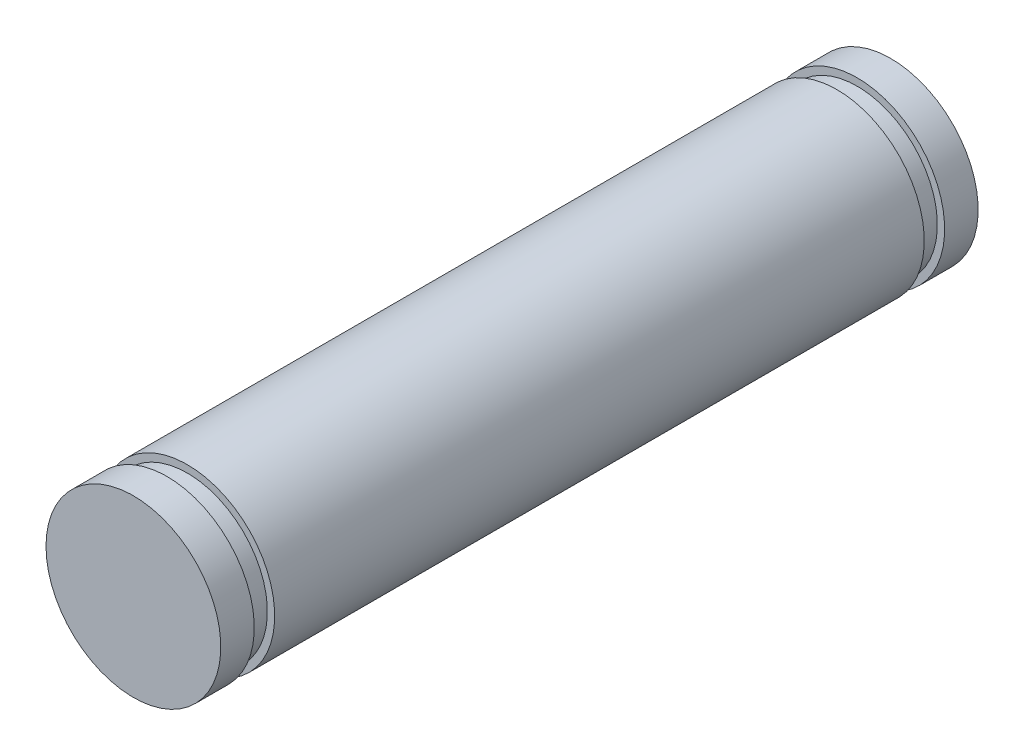
ISO-10303-21;
HEADER;
FILE_DESCRIPTION(('STEP AP214'),'2;1');
FILE_NAME('part.step','',(''),(''),'','','');
FILE_SCHEMA(('AUTOMOTIVE_DESIGN { 1 0 10303 214 1 1 1 1 }'));
ENDSEC;
DATA;
#1=APPLICATION_CONTEXT('core data for automotive mechanical design processes');
#2=APPLICATION_PROTOCOL_DEFINITION('international standard','automotive_design',2000,#1);
#3=PRODUCT_CONTEXT('',#1,'mechanical');
#4=PRODUCT('Part','Part','',(#3));
#5=PRODUCT_RELATED_PRODUCT_CATEGORY('part','',(#4));
#6=PRODUCT_DEFINITION_FORMATION('','',#4);
#7=PRODUCT_DEFINITION_CONTEXT('part definition',#1,'design');
#8=PRODUCT_DEFINITION('design','',#6,#7);
#9=PRODUCT_DEFINITION_SHAPE('','',#8);
#10=(LENGTH_UNIT() NAMED_UNIT(*) SI_UNIT(.MILLI.,.METRE.));
#11=(NAMED_UNIT(*) PLANE_ANGLE_UNIT() SI_UNIT($,.RADIAN.));
#12=(NAMED_UNIT(*) SI_UNIT($,.STERADIAN.) SOLID_ANGLE_UNIT());
#13=UNCERTAINTY_MEASURE_WITH_UNIT(LENGTH_MEASURE(1.E-05),#10,'distance_accuracy_value','');
#14=(GEOMETRIC_REPRESENTATION_CONTEXT(3) GLOBAL_UNCERTAINTY_ASSIGNED_CONTEXT((#13)) GLOBAL_UNIT_ASSIGNED_CONTEXT((#10,
#11,#12)) REPRESENTATION_CONTEXT('',''));
#15=CARTESIAN_POINT('',(0.,0.,0.));
#16=DIRECTION('',(0.,0.,1.));
#17=DIRECTION('',(1.,0.,0.));
#18=AXIS2_PLACEMENT_3D('',#15,#16,#17);
#19=CARTESIAN_POINT('',(0.,0.,26.));
#20=DIRECTION('',(0.,0.,-1.));
#21=DIRECTION('',(-1.,0.,0.));
#22=AXIS2_PLACEMENT_3D('',#19,#20,#21);
#23=CYLINDRICAL_SURFACE('',#22,3.);
#24=CARTESIAN_POINT('',(0.,0.,1.85));
#25=DIRECTION('',(0.,0.,-1.));
#26=DIRECTION('',(-1.,0.,0.));
#27=AXIS2_PLACEMENT_3D('',#24,#25,#26);
#28=CIRCLE('',#27,3.);
#29=CARTESIAN_POINT('',(-3.,0.,1.85));
#30=VERTEX_POINT('',#29);
#31=EDGE_CURVE('E82',#30,#30,#28,.T.);
#32=CARTESIAN_POINT('',(0.,0.,24.15));
#33=DIRECTION('',(0.,0.,-1.));
#34=DIRECTION('',(-1.,0.,0.));
#35=AXIS2_PLACEMENT_3D('',#32,#33,#34);
#36=CIRCLE('',#35,3.);
#37=CARTESIAN_POINT('',(-3.,0.,24.15));
#38=VERTEX_POINT('',#37);
#39=EDGE_CURVE('E98',#38,#38,#36,.T.);
#40=CARTESIAN_POINT('',(-3.,0.,1.85));
#41=CARTESIAN_POINT('',(-3.,0.,2.08229166666666));
#42=CARTESIAN_POINT('',(-3.,0.,2.31458333333333));
#43=CARTESIAN_POINT('',(-3.,0.,2.77916666666666));
#44=CARTESIAN_POINT('',(-3.,0.,3.01145833333333));
#45=CARTESIAN_POINT('',(-3.,0.,3.47604166666666));
#46=CARTESIAN_POINT('',(-3.,0.,3.70833333333333));
#47=CARTESIAN_POINT('',(-3.,0.,4.17291666666666));
#48=CARTESIAN_POINT('',(-3.,0.,4.40520833333333));
#49=CARTESIAN_POINT('',(-3.,0.,4.86979166666667));
#50=CARTESIAN_POINT('',(-3.,0.,5.10208333333333));
#51=CARTESIAN_POINT('',(-3.,0.,5.56666666666666));
#52=CARTESIAN_POINT('',(-3.,0.,5.79895833333333));
#53=CARTESIAN_POINT('',(-3.,0.,6.26354166666667));
#54=CARTESIAN_POINT('',(-3.,0.,6.49583333333333));
#55=CARTESIAN_POINT('',(-3.,0.,6.96041666666667));
#56=CARTESIAN_POINT('',(-3.,0.,7.19270833333333));
#57=CARTESIAN_POINT('',(-3.,0.,7.65729166666667));
#58=CARTESIAN_POINT('',(-3.,0.,7.88958333333333));
#59=CARTESIAN_POINT('',(-3.,0.,8.35416666666667));
#60=CARTESIAN_POINT('',(-3.,0.,8.58645833333333));
#61=CARTESIAN_POINT('',(-3.,0.,9.05104166666667));
#62=CARTESIAN_POINT('',(-3.,0.,9.28333333333333));
#63=CARTESIAN_POINT('',(-3.,0.,9.74791666666667));
#64=CARTESIAN_POINT('',(-3.,0.,9.98020833333333));
#65=CARTESIAN_POINT('',(-3.,0.,10.4447916666667));
#66=CARTESIAN_POINT('',(-3.,0.,10.6770833333333));
#67=CARTESIAN_POINT('',(-3.,0.,11.1416666666667));
#68=CARTESIAN_POINT('',(-3.,0.,11.3739583333333));
#69=CARTESIAN_POINT('',(-3.,0.,11.8385416666667));
#70=CARTESIAN_POINT('',(-3.,0.,12.0708333333333));
#71=CARTESIAN_POINT('',(-3.,0.,12.5354166666667));
#72=CARTESIAN_POINT('',(-3.,0.,12.7677083333333));
#73=CARTESIAN_POINT('',(-3.,0.,13.2322916666667));
#74=CARTESIAN_POINT('',(-3.,0.,13.4645833333333));
#75=CARTESIAN_POINT('',(-3.,0.,13.9291666666667));
#76=CARTESIAN_POINT('',(-3.,0.,14.1614583333333));
#77=CARTESIAN_POINT('',(-3.,0.,14.6260416666667));
#78=CARTESIAN_POINT('',(-3.,0.,14.8583333333333));
#79=CARTESIAN_POINT('',(-3.,0.,15.3229166666667));
#80=CARTESIAN_POINT('',(-3.,0.,15.5552083333333));
#81=CARTESIAN_POINT('',(-3.,0.,16.0197916666667));
#82=CARTESIAN_POINT('',(-3.,0.,16.2520833333333));
#83=CARTESIAN_POINT('',(-3.,0.,16.7166666666667));
#84=CARTESIAN_POINT('',(-3.,0.,16.9489583333333));
#85=CARTESIAN_POINT('',(-3.,0.,17.4135416666667));
#86=CARTESIAN_POINT('',(-3.,0.,17.6458333333333));
#87=CARTESIAN_POINT('',(-3.,0.,18.1104166666667));
#88=CARTESIAN_POINT('',(-3.,0.,18.3427083333333));
#89=CARTESIAN_POINT('',(-3.,0.,18.8072916666667));
#90=CARTESIAN_POINT('',(-3.,0.,19.0395833333333));
#91=CARTESIAN_POINT('',(-3.,0.,19.5041666666667));
#92=CARTESIAN_POINT('',(-3.,0.,19.7364583333333));
#93=CARTESIAN_POINT('',(-3.,0.,20.2010416666667));
#94=CARTESIAN_POINT('',(-3.,0.,20.4333333333333));
#95=CARTESIAN_POINT('',(-3.,0.,20.8979166666667));
#96=CARTESIAN_POINT('',(-3.,0.,21.1302083333333));
#97=CARTESIAN_POINT('',(-3.,0.,21.5947916666667));
#98=CARTESIAN_POINT('',(-3.,0.,21.8270833333333));
#99=CARTESIAN_POINT('',(-3.,0.,22.2916666666667));
#100=CARTESIAN_POINT('',(-3.,0.,22.5239583333333));
#101=CARTESIAN_POINT('',(-3.,0.,22.9885416666667));
#102=CARTESIAN_POINT('',(-3.,0.,23.2208333333333));
#103=CARTESIAN_POINT('',(-3.,0.,23.6854166666667));
#104=CARTESIAN_POINT('',(-3.,0.,23.9177083333333));
#105=CARTESIAN_POINT('',(-3.,0.,24.15));
#106=B_SPLINE_CURVE_WITH_KNOTS('',3,(#40,#41,#42,#43,#44,#45,#46,#47,#48,#49,#50,#51,#52,#53,
#54,#55,#56,#57,#58,#59,#60,#61,#62,#63,#64,#65,#66,#67,#68,#69,#70,#71,#72,#73,#74,#75,#76,#77,
#78,#79,#80,#81,#82,#83,#84,#85,#86,#87,#88,#89,#90,#91,#92,#93,#94,#95,#96,#97,#98,#99,#100,
#101,#102,#103,#104,#105),.UNSPECIFIED.,.F.,.F.,(4,2,2,2,2,2,2,2,2,2,2,2,2,2,2,2,2,2,2,2,2,2,2,
2,2,2,2,2,2,2,2,2,4),(0.,0.696875,1.39375,2.090625,2.7875,3.484375,4.18125,4.878125,5.575,
6.271875,6.96875,7.665625,8.3625,9.059375,9.75625,10.453125,11.15,11.846875,12.54375,13.240625,
13.9375,14.634375,15.33125,16.028125,16.725,17.421875,18.11875,18.815625,19.5125,20.209375,
20.90625,21.603125,22.3),.UNSPECIFIED.);
#107=EDGE_CURVE('BSEAM60',#30,#38,#106,.T.);
#108=ORIENTED_EDGE('',*,*,#31,.F.);
#109=ORIENTED_EDGE('',*,*,#39,.T.);
#110=ORIENTED_EDGE('',*,*,#107,.T.);
#111=ORIENTED_EDGE('',*,*,#107,.F.);
#112=EDGE_LOOP('',(#108,#110,#109,#111));
#113=FACE_BOUND('',#112,.T.);
#114=ADVANCED_FACE('F60',(#113),#23,.T.);
#115=CARTESIAN_POINT('',(0.,0.,1.15));
#116=DIRECTION('',(0.,0.,-1.));
#117=DIRECTION('',(-1.,0.,0.));
#118=AXIS2_PLACEMENT_3D('',#115,#116,#117);
#119=CIRCLE('',#118,3.);
#120=CARTESIAN_POINT('',(-3.,0.,1.15));
#121=VERTEX_POINT('',#120);
#122=EDGE_CURVE('E73',#121,#121,#119,.T.);
#123=CARTESIAN_POINT('',(0.,0.,0.));
#124=DIRECTION('',(0.,0.,1.));
#125=DIRECTION('',(1.,0.,0.));
#126=AXIS2_PLACEMENT_3D('',#123,#124,#125);
#127=CIRCLE('',#126,3.);
#128=CARTESIAN_POINT('',(-3.,0.,0.));
#129=VERTEX_POINT('',#128);
#130=EDGE_CURVE('E64',#129,#129,#127,.T.);
#131=CARTESIAN_POINT('',(-3.,0.,1.15));
#132=CARTESIAN_POINT('',(-3.,0.,1.13802083333333));
#133=CARTESIAN_POINT('',(-3.,0.,1.12604166666667));
#134=CARTESIAN_POINT('',(-3.,0.,1.10208333333333));
#135=CARTESIAN_POINT('',(-3.,0.,1.09010416666667));
#136=CARTESIAN_POINT('',(-3.,0.,1.06614583333333));
#137=CARTESIAN_POINT('',(-3.,0.,1.05416666666667));
#138=CARTESIAN_POINT('',(-3.,0.,1.03020833333333));
#139=CARTESIAN_POINT('',(-3.,0.,1.01822916666667));
#140=CARTESIAN_POINT('',(-3.,0.,0.994270833333332));
#141=CARTESIAN_POINT('',(-3.,0.,0.982291666666665));
#142=CARTESIAN_POINT('',(-3.,0.,0.958333333333331));
#143=CARTESIAN_POINT('',(-3.,0.,0.946354166666664));
#144=CARTESIAN_POINT('',(-3.,0.,0.922395833333331));
#145=CARTESIAN_POINT('',(-3.,0.,0.910416666666665));
#146=CARTESIAN_POINT('',(-3.,0.,0.886458333333332));
#147=CARTESIAN_POINT('',(-3.,0.,0.874479166666665));
#148=CARTESIAN_POINT('',(-3.,0.,0.850520833333332));
#149=CARTESIAN_POINT('',(-3.,0.,0.838541666666666));
#150=CARTESIAN_POINT('',(-3.,0.,0.814583333333333));
#151=CARTESIAN_POINT('',(-3.,0.,0.802604166666666));
#152=CARTESIAN_POINT('',(-3.,0.,0.778645833333333));
#153=CARTESIAN_POINT('',(-3.,0.,0.766666666666667));
#154=CARTESIAN_POINT('',(-3.,0.,0.742708333333333));
#155=CARTESIAN_POINT('',(-3.,0.,0.730729166666665));
#156=CARTESIAN_POINT('',(-3.,0.,0.706770833333331));
#157=CARTESIAN_POINT('',(-3.,0.,0.694791666666664));
#158=CARTESIAN_POINT('',(-3.,0.,0.670833333333331));
#159=CARTESIAN_POINT('',(-3.,0.,0.658854166666665));
#160=CARTESIAN_POINT('',(-3.,0.,0.634895833333332));
#161=CARTESIAN_POINT('',(-3.,0.,0.622916666666665));
#162=CARTESIAN_POINT('',(-3.,0.,0.598958333333332));
#163=CARTESIAN_POINT('',(-3.,0.,0.586979166666666));
#164=CARTESIAN_POINT('',(-3.,0.,0.563020833333333));
#165=CARTESIAN_POINT('',(-3.,0.,0.551041666666666));
#166=CARTESIAN_POINT('',(-3.,0.,0.527083333333333));
#167=CARTESIAN_POINT('',(-3.,0.,0.515104166666667));
#168=CARTESIAN_POINT('',(-3.,0.,0.491145833333334));
#169=CARTESIAN_POINT('',(-3.,0.,0.479166666666667));
#170=CARTESIAN_POINT('',(-3.,0.,0.455208333333334));
#171=CARTESIAN_POINT('',(-3.,0.,0.443229166666668));
#172=CARTESIAN_POINT('',(-3.,0.,0.419270833333333));
#173=CARTESIAN_POINT('',(-3.,0.,0.407291666666666));
#174=CARTESIAN_POINT('',(-3.,0.,0.383333333333332));
#175=CARTESIAN_POINT('',(-3.,0.,0.371354166666665));
#176=CARTESIAN_POINT('',(-3.,0.,0.347395833333332));
#177=CARTESIAN_POINT('',(-3.,0.,0.335416666666666));
#178=CARTESIAN_POINT('',(-3.,0.,0.311458333333333));
#179=CARTESIAN_POINT('',(-3.,0.,0.299479166666666));
#180=CARTESIAN_POINT('',(-3.,0.,0.275520833333333));
#181=CARTESIAN_POINT('',(-3.,0.,0.263541666666667));
#182=CARTESIAN_POINT('',(-3.,0.,0.239583333333334));
#183=CARTESIAN_POINT('',(-3.,0.,0.227604166666667));
#184=CARTESIAN_POINT('',(-3.,0.,0.203645833333334));
#185=CARTESIAN_POINT('',(-3.,0.,0.191666666666668));
#186=CARTESIAN_POINT('',(-3.,0.,0.167708333333333));
#187=CARTESIAN_POINT('',(-3.,0.,0.155729166666666));
#188=CARTESIAN_POINT('',(-3.,0.,0.131770833333332));
#189=CARTESIAN_POINT('',(-3.,0.,0.119791666666665));
#190=CARTESIAN_POINT('',(-3.,0.,0.095833333333332));
#191=CARTESIAN_POINT('',(-3.,0.,0.0838541666666655));
#192=CARTESIAN_POINT('',(-3.,0.,0.0598958333333325));
#193=CARTESIAN_POINT('',(-3.,0.,0.047916666666666));
#194=CARTESIAN_POINT('',(-3.,0.,0.023958333333333));
#195=CARTESIAN_POINT('',(-3.,0.,0.0119791666666665));
#196=CARTESIAN_POINT('',(-3.,0.,0.));
#197=B_SPLINE_CURVE_WITH_KNOTS('',3,(#131,#132,#133,#134,#135,#136,#137,#138,#139,#140,#141,
#142,#143,#144,#145,#146,#147,#148,#149,#150,#151,#152,#153,#154,#155,#156,#157,#158,#159,#160,
#161,#162,#163,#164,#165,#166,#167,#168,#169,#170,#171,#172,#173,#174,#175,#176,#177,#178,#179,
#180,#181,#182,#183,#184,#185,#186,#187,#188,#189,#190,#191,#192,#193,#194,#195,#196),
.UNSPECIFIED.,.F.,.F.,(4,2,2,2,2,2,2,2,2,2,2,2,2,2,2,2,2,2,2,2,2,2,2,2,2,2,2,2,2,2,2,2,4),(0.,
0.0359374999999995,0.071874999999999,0.107812499999999,0.143749999999998,0.179687500000001,
0.215625000000001,0.2515625,0.2875,0.323437499999999,0.359374999999999,0.395312499999998,
0.431250000000001,0.467187500000001,0.503125,0.5390625,0.574999999999999,0.610937499999999,
0.646874999999998,0.682812499999998,0.718749999999997,0.7546875,0.790625,0.826562499999999,
0.862499999999999,0.898437499999998,0.934374999999998,0.970312499999997,1.00625,1.0421875,
1.078125,1.1140625,1.15),.UNSPECIFIED.);
#198=EDGE_CURVE('BSEAM62',#121,#129,#197,.T.);
#199=ORIENTED_EDGE('',*,*,#122,.T.);
#200=ORIENTED_EDGE('',*,*,#130,.T.);
#201=ORIENTED_EDGE('',*,*,#198,.T.);
#202=ORIENTED_EDGE('',*,*,#198,.F.);
#203=EDGE_LOOP('',(#199,#201,#200,#202));
#204=FACE_BOUND('',#203,.T.);
#205=ADVANCED_FACE('F62',(#204),#23,.T.);
#206=CARTESIAN_POINT('',(0.,0.,0.));
#207=DIRECTION('',(0.,0.,1.));
#208=DIRECTION('',(1.,0.,0.));
#209=AXIS2_PLACEMENT_3D('',#206,#207,#208);
#210=PLANE('',#209);
#211=ORIENTED_EDGE('',*,*,#130,.F.);
#212=EDGE_LOOP('',(#211));
#213=FACE_BOUND('',#212,.T.);
#214=ADVANCED_FACE('F132',(#213),#210,.F.);
#215=CARTESIAN_POINT('',(0.,0.,1.15));
#216=DIRECTION('',(0.,0.,-1.));
#217=DIRECTION('',(-1.,0.,0.));
#218=AXIS2_PLACEMENT_3D('',#215,#216,#217);
#219=PLANE('',#218);
#220=ORIENTED_EDGE('',*,*,#122,.F.);
#221=EDGE_LOOP('',(#220));
#222=FACE_BOUND('',#221,.T.);
#223=CARTESIAN_POINT('',(0.,0.,1.15));
#224=DIRECTION('',(0.,0.,-1.));
#225=DIRECTION('',(-1.,0.,0.));
#226=AXIS2_PLACEMENT_3D('',#223,#224,#225);
#227=CIRCLE('',#226,2.75);
#228=CARTESIAN_POINT('',(-2.75,0.,1.15));
#229=VERTEX_POINT('',#228);
#230=EDGE_CURVE('E78',#229,#229,#227,.T.);
#231=ORIENTED_EDGE('',*,*,#230,.T.);
#232=EDGE_LOOP('',(#231));
#233=FACE_BOUND('',#232,.T.);
#234=ADVANCED_FACE('F151',(#222,#233),#219,.F.);
#235=CARTESIAN_POINT('',(0.,0.,1.15));
#236=DIRECTION('',(0.,0.,1.));
#237=DIRECTION('',(1.,0.,0.));
#238=AXIS2_PLACEMENT_3D('',#235,#236,#237);
#239=CYLINDRICAL_SURFACE('',#238,2.75);
#240=ORIENTED_EDGE('',*,*,#230,.F.);
#241=EDGE_LOOP('',(#240));
#242=FACE_BOUND('',#241,.T.);
#243=CARTESIAN_POINT('',(0.,0.,1.85));
#244=DIRECTION('',(0.,0.,-1.));
#245=DIRECTION('',(-1.,0.,0.));
#246=AXIS2_PLACEMENT_3D('',#243,#244,#245);
#247=CIRCLE('',#246,2.75);
#248=CARTESIAN_POINT('',(-2.75,0.,1.85));
#249=VERTEX_POINT('',#248);
#250=EDGE_CURVE('E86',#249,#249,#247,.T.);
#251=ORIENTED_EDGE('',*,*,#250,.T.);
#252=EDGE_LOOP('',(#251));
#253=FACE_BOUND('',#252,.T.);
#254=ADVANCED_FACE('F158',(#242,#253),#239,.T.);
#255=CARTESIAN_POINT('',(0.,0.,1.85));
#256=DIRECTION('',(0.,0.,-1.));
#257=DIRECTION('',(-1.,0.,0.));
#258=AXIS2_PLACEMENT_3D('',#255,#256,#257);
#259=PLANE('',#258);
#260=ORIENTED_EDGE('',*,*,#250,.F.);
#261=EDGE_LOOP('',(#260));
#262=FACE_BOUND('',#261,.T.);
#263=ORIENTED_EDGE('',*,*,#31,.T.);
#264=EDGE_LOOP('',(#263));
#265=FACE_BOUND('',#264,.T.);
#266=ADVANCED_FACE('F121',(#262,#265),#259,.T.);
#267=CARTESIAN_POINT('',(0.,0.,24.85));
#268=DIRECTION('',(0.,0.,1.));
#269=DIRECTION('',(-1.,0.,0.));
#270=AXIS2_PLACEMENT_3D('',#267,#268,#269);
#271=PLANE('',#270);
#272=CARTESIAN_POINT('',(0.,0.,24.85));
#273=DIRECTION('',(0.,0.,-1.));
#274=DIRECTION('',(-1.,0.,0.));
#275=AXIS2_PLACEMENT_3D('',#272,#273,#274);
#276=CIRCLE('',#275,2.75);
#277=CARTESIAN_POINT('',(-2.75,0.,24.85));
#278=VERTEX_POINT('',#277);
#279=EDGE_CURVE('E94',#278,#278,#276,.T.);
#280=ORIENTED_EDGE('',*,*,#279,.F.);
#281=EDGE_LOOP('',(#280));
#282=FACE_BOUND('',#281,.T.);
#283=CARTESIAN_POINT('',(0.,0.,24.85));
#284=DIRECTION('',(0.,0.,-1.));
#285=DIRECTION('',(-1.,0.,0.));
#286=AXIS2_PLACEMENT_3D('',#283,#284,#285);
#287=CIRCLE('',#286,3.);
#288=CARTESIAN_POINT('',(-3.,0.,24.85));
#289=VERTEX_POINT('',#288);
#290=EDGE_CURVE('E90',#289,#289,#287,.T.);
#291=ORIENTED_EDGE('',*,*,#290,.T.);
#292=EDGE_LOOP('',(#291));
#293=FACE_BOUND('',#292,.T.);
#294=ADVANCED_FACE('F111',(#282,#293),#271,.F.);
#295=CARTESIAN_POINT('',(0.,0.,24.85));
#296=DIRECTION('',(0.,0.,-1.));
#297=DIRECTION('',(-1.,0.,0.));
#298=AXIS2_PLACEMENT_3D('',#295,#296,#297);
#299=CYLINDRICAL_SURFACE('',#298,2.75);
#300=ORIENTED_EDGE('',*,*,#279,.T.);
#301=EDGE_LOOP('',(#300));
#302=FACE_BOUND('',#301,.T.);
#303=CARTESIAN_POINT('',(0.,0.,24.15));
#304=DIRECTION('',(0.,0.,-1.));
#305=DIRECTION('',(-1.,0.,0.));
#306=AXIS2_PLACEMENT_3D('',#303,#304,#305);
#307=CIRCLE('',#306,2.75);
#308=CARTESIAN_POINT('',(-2.75,0.,24.15));
#309=VERTEX_POINT('',#308);
#310=EDGE_CURVE('E102',#309,#309,#307,.T.);
#311=ORIENTED_EDGE('',*,*,#310,.F.);
#312=EDGE_LOOP('',(#311));
#313=FACE_BOUND('',#312,.T.);
#314=ADVANCED_FACE('F109',(#302,#313),#299,.T.);
#315=CARTESIAN_POINT('',(0.,0.,24.15));
#316=DIRECTION('',(0.,0.,1.));
#317=DIRECTION('',(-1.,0.,0.));
#318=AXIS2_PLACEMENT_3D('',#315,#316,#317);
#319=PLANE('',#318);
#320=ORIENTED_EDGE('',*,*,#39,.F.);
#321=EDGE_LOOP('',(#320));
#322=FACE_BOUND('',#321,.T.);
#323=ORIENTED_EDGE('',*,*,#310,.T.);
#324=EDGE_LOOP('',(#323));
#325=FACE_BOUND('',#324,.T.);
#326=ADVANCED_FACE('F107',(#322,#325),#319,.T.);
#327=CARTESIAN_POINT('',(0.,0.,26.));
#328=DIRECTION('',(0.,0.,1.));
#329=DIRECTION('',(1.,0.,0.));
#330=AXIS2_PLACEMENT_3D('',#327,#328,#329);
#331=PLANE('',#330);
#332=CARTESIAN_POINT('',(0.,0.,26.));
#333=DIRECTION('',(0.,0.,1.));
#334=DIRECTION('',(1.,0.,0.));
#335=AXIS2_PLACEMENT_3D('',#332,#333,#334);
#336=CIRCLE('',#335,3.);
#337=CARTESIAN_POINT('',(-3.,0.,26.));
#338=VERTEX_POINT('',#337);
#339=EDGE_CURVE('E11',#338,#338,#336,.T.);
#340=ORIENTED_EDGE('',*,*,#339,.T.);
#341=EDGE_LOOP('',(#340));
#342=FACE_BOUND('',#341,.T.);
#343=ADVANCED_FACE('F118',(#342),#331,.T.);
#344=CARTESIAN_POINT('',(-3.,0.,24.85));
#345=CARTESIAN_POINT('',(-3.,0.,24.8619791666667));
#346=CARTESIAN_POINT('',(-3.,0.,24.8739583333333));
#347=CARTESIAN_POINT('',(-3.,0.,24.8979166666667));
#348=CARTESIAN_POINT('',(-3.,0.,24.9098958333333));
#349=CARTESIAN_POINT('',(-3.,0.,24.9338541666667));
#350=CARTESIAN_POINT('',(-3.,0.,24.9458333333333));
#351=CARTESIAN_POINT('',(-3.,0.,24.9697916666667));
#352=CARTESIAN_POINT('',(-3.,0.,24.9817708333333));
#353=CARTESIAN_POINT('',(-3.,0.,25.0057291666667));
#354=CARTESIAN_POINT('',(-3.,0.,25.0177083333333));
#355=CARTESIAN_POINT('',(-3.,0.,25.0416666666667));
#356=CARTESIAN_POINT('',(-3.,0.,25.0536458333333));
#357=CARTESIAN_POINT('',(-3.,0.,25.0776041666667));
#358=CARTESIAN_POINT('',(-3.,0.,25.0895833333333));
#359=CARTESIAN_POINT('',(-3.,0.,25.1135416666667));
#360=CARTESIAN_POINT('',(-3.,0.,25.1255208333333));
#361=CARTESIAN_POINT('',(-3.,0.,25.1494791666667));
#362=CARTESIAN_POINT('',(-3.,0.,25.1614583333333));
#363=CARTESIAN_POINT('',(-3.,0.,25.1854166666667));
#364=CARTESIAN_POINT('',(-3.,0.,25.1973958333333));
#365=CARTESIAN_POINT('',(-3.,0.,25.2213541666667));
#366=CARTESIAN_POINT('',(-3.,0.,25.2333333333333));
#367=CARTESIAN_POINT('',(-3.,0.,25.2572916666667));
#368=CARTESIAN_POINT('',(-3.,0.,25.2692708333333));
#369=CARTESIAN_POINT('',(-3.,0.,25.2932291666667));
#370=CARTESIAN_POINT('',(-3.,0.,25.3052083333333));
#371=CARTESIAN_POINT('',(-3.,0.,25.3291666666667));
#372=CARTESIAN_POINT('',(-3.,0.,25.3411458333333));
#373=CARTESIAN_POINT('',(-3.,0.,25.3651041666667));
#374=CARTESIAN_POINT('',(-3.,0.,25.3770833333333));
#375=CARTESIAN_POINT('',(-3.,0.,25.4010416666667));
#376=CARTESIAN_POINT('',(-3.,0.,25.4130208333333));
#377=CARTESIAN_POINT('',(-3.,0.,25.4369791666667));
#378=CARTESIAN_POINT('',(-3.,0.,25.4489583333333));
#379=CARTESIAN_POINT('',(-3.,0.,25.4729166666667));
#380=CARTESIAN_POINT('',(-3.,0.,25.4848958333333));
#381=CARTESIAN_POINT('',(-3.,0.,25.5088541666667));
#382=CARTESIAN_POINT('',(-3.,0.,25.5208333333333));
#383=CARTESIAN_POINT('',(-3.,0.,25.5447916666667));
#384=CARTESIAN_POINT('',(-3.,0.,25.5567708333333));
#385=CARTESIAN_POINT('',(-3.,0.,25.5807291666667));
#386=CARTESIAN_POINT('',(-3.,0.,25.5927083333333));
#387=CARTESIAN_POINT('',(-3.,0.,25.6166666666667));
#388=CARTESIAN_POINT('',(-3.,0.,25.6286458333333));
#389=CARTESIAN_POINT('',(-3.,0.,25.6526041666667));
#390=CARTESIAN_POINT('',(-3.,0.,25.6645833333333));
#391=CARTESIAN_POINT('',(-3.,0.,25.6885416666667));
#392=CARTESIAN_POINT('',(-3.,0.,25.7005208333333));
#393=CARTESIAN_POINT('',(-3.,0.,25.7244791666667));
#394=CARTESIAN_POINT('',(-3.,0.,25.7364583333333));
#395=CARTESIAN_POINT('',(-3.,0.,25.7604166666667));
#396=CARTESIAN_POINT('',(-3.,0.,25.7723958333333));
#397=CARTESIAN_POINT('',(-3.,0.,25.7963541666667));
#398=CARTESIAN_POINT('',(-3.,0.,25.8083333333333));
#399=CARTESIAN_POINT('',(-3.,0.,25.8322916666667));
#400=CARTESIAN_POINT('',(-3.,0.,25.8442708333333));
#401=CARTESIAN_POINT('',(-3.,0.,25.8682291666667));
#402=CARTESIAN_POINT('',(-3.,0.,25.8802083333333));
#403=CARTESIAN_POINT('',(-3.,0.,25.9041666666667));
#404=CARTESIAN_POINT('',(-3.,0.,25.9161458333333));
#405=CARTESIAN_POINT('',(-3.,0.,25.9401041666667));
#406=CARTESIAN_POINT('',(-3.,0.,25.9520833333333));
#407=CARTESIAN_POINT('',(-3.,0.,25.9760416666667));
#408=CARTESIAN_POINT('',(-3.,0.,25.9880208333333));
#409=CARTESIAN_POINT('',(-3.,0.,26.));
#410=B_SPLINE_CURVE_WITH_KNOTS('',3,(#344,#345,#346,#347,#348,#349,#350,#351,#352,#353,#354,
#355,#356,#357,#358,#359,#360,#361,#362,#363,#364,#365,#366,#367,#368,#369,#370,#371,#372,#373,
#374,#375,#376,#377,#378,#379,#380,#381,#382,#383,#384,#385,#386,#387,#388,#389,#390,#391,#392,
#393,#394,#395,#396,#397,#398,#399,#400,#401,#402,#403,#404,#405,#406,#407,#408,#409),
.UNSPECIFIED.,.F.,.F.,(4,2,2,2,2,2,2,2,2,2,2,2,2,2,2,2,2,2,2,2,2,2,2,2,2,2,2,2,2,2,2,2,4),(0.,
0.035937500000003,0.0718750000000025,0.107812500000002,0.143750000000002,0.179687500000001,
0.215625000000001,0.2515625,0.2875,0.323437499999999,0.359374999999999,0.395312499999998,
0.431250000000001,0.467187500000001,0.503125,0.5390625,0.574999999999999,0.610937499999999,
0.646874999999998,0.682812499999998,0.718749999999997,0.754687499999997,0.790625,
0.826562499999999,0.862499999999999,0.898437499999998,0.934374999999998,0.970312499999997,
1.00625,1.0421875,1.078125,1.1140625,1.15),.UNSPECIFIED.);
#411=EDGE_CURVE('BSEAM126',#289,#338,#410,.T.);
#412=ORIENTED_EDGE('',*,*,#290,.F.);
#413=ORIENTED_EDGE('',*,*,#339,.F.);
#414=ORIENTED_EDGE('',*,*,#411,.T.);
#415=ORIENTED_EDGE('',*,*,#411,.F.);
#416=EDGE_LOOP('',(#412,#414,#413,#415));
#417=FACE_BOUND('',#416,.T.);
#418=ADVANCED_FACE('F126',(#417),#23,.T.);
#419=CLOSED_SHELL('',(#114,#205,#214,#234,#254,#266,#294,#314,#326,#343,#418));
#420=MANIFOLD_SOLID_BREP('B2',#419);
#421=ADVANCED_BREP_SHAPE_REPRESENTATION('',(#18,#420),#14);
#422=SHAPE_DEFINITION_REPRESENTATION(#9,#421);
ENDSEC;
END-ISO-10303-21;
